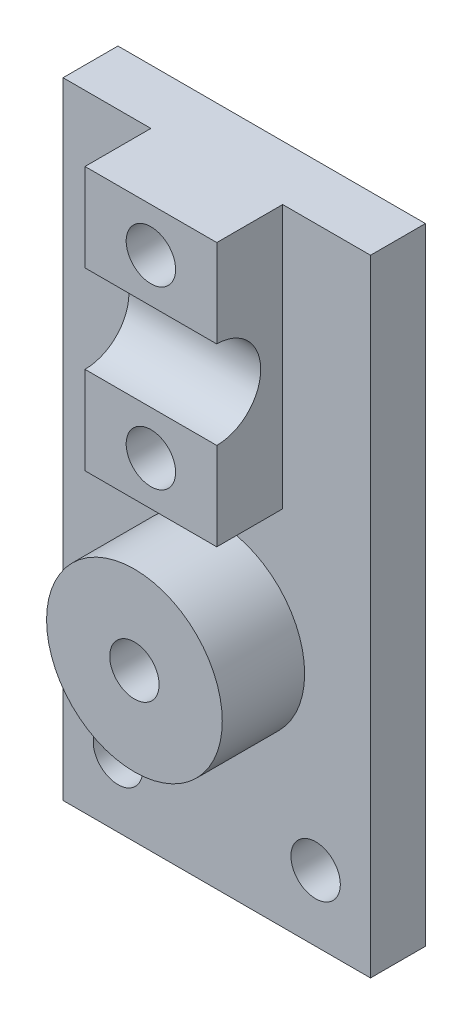
ISO-10303-21;
HEADER;
FILE_DESCRIPTION(('STEP AP214'),'2;1');
FILE_NAME('part.step','',(''),(''),'','','');
FILE_SCHEMA(('AUTOMOTIVE_DESIGN { 1 0 10303 214 1 1 1 1 }'));
ENDSEC;
DATA;
#1=APPLICATION_CONTEXT('core data for automotive mechanical design processes');
#2=APPLICATION_PROTOCOL_DEFINITION('international standard','automotive_design',2000,#1);
#3=PRODUCT_CONTEXT('',#1,'mechanical');
#4=PRODUCT('Part','Part','',(#3));
#5=PRODUCT_RELATED_PRODUCT_CATEGORY('part','',(#4));
#6=PRODUCT_DEFINITION_FORMATION('','',#4);
#7=PRODUCT_DEFINITION_CONTEXT('part definition',#1,'design');
#8=PRODUCT_DEFINITION('design','',#6,#7);
#9=PRODUCT_DEFINITION_SHAPE('','',#8);
#10=(LENGTH_UNIT() NAMED_UNIT(*) SI_UNIT(.MILLI.,.METRE.));
#11=(NAMED_UNIT(*) PLANE_ANGLE_UNIT() SI_UNIT($,.RADIAN.));
#12=(NAMED_UNIT(*) SI_UNIT($,.STERADIAN.) SOLID_ANGLE_UNIT());
#13=UNCERTAINTY_MEASURE_WITH_UNIT(LENGTH_MEASURE(1.E-05),#10,'distance_accuracy_value','');
#14=(GEOMETRIC_REPRESENTATION_CONTEXT(3) GLOBAL_UNCERTAINTY_ASSIGNED_CONTEXT((#13)) GLOBAL_UNIT_ASSIGNED_CONTEXT((#10,
#11,#12)) REPRESENTATION_CONTEXT('',''));
#15=CARTESIAN_POINT('',(0.,0.,0.));
#16=DIRECTION('',(0.,0.,1.));
#17=DIRECTION('',(1.,0.,0.));
#18=AXIS2_PLACEMENT_3D('',#15,#16,#17);
#19=CARTESIAN_POINT('',(0.,0.,5.));
#20=DIRECTION('',(0.,0.,1.));
#21=DIRECTION('',(1.,0.,0.));
#22=AXIS2_PLACEMENT_3D('',#19,#20,#21);
#23=PLANE('',#22);
#24=DIRECTION('',(0.,1.,0.));
#25=VECTOR('',#24,1.);
#26=CARTESIAN_POINT('',(6.,0.,5.));
#27=LINE('',#26,#25);
#28=CARTESIAN_POINT('',(6.,-24.,5.));
#29=VERTEX_POINT('',#28);
#30=CARTESIAN_POINT('',(6.,0.,5.));
#31=VERTEX_POINT('',#30);
#32=EDGE_CURVE('E138',#29,#31,#27,.T.);
#33=ORIENTED_EDGE('',*,*,#32,.F.);
#34=DIRECTION('',(1.,0.,0.));
#35=VECTOR('',#34,1.);
#36=CARTESIAN_POINT('',(-6.,-24.,5.));
#37=LINE('',#36,#35);
#38=CARTESIAN_POINT('',(-6.,-24.,5.));
#39=VERTEX_POINT('',#38);
#40=EDGE_CURVE('E181',#39,#29,#37,.T.);
#41=ORIENTED_EDGE('',*,*,#40,.F.);
#42=DIRECTION('',(0.,1.,0.));
#43=VECTOR('',#42,1.);
#44=CARTESIAN_POINT('',(-6.,0.,5.));
#45=LINE('',#44,#43);
#46=CARTESIAN_POINT('',(-6.,0.,5.));
#47=VERTEX_POINT('',#46);
#48=EDGE_CURVE('E129',#39,#47,#45,.T.);
#49=ORIENTED_EDGE('',*,*,#48,.T.);
#50=DIRECTION('',(-1.,0.,0.));
#51=VECTOR('',#50,1.);
#52=CARTESIAN_POINT('',(-14.,0.,5.));
#53=LINE('',#52,#51);
#54=CARTESIAN_POINT('',(-14.,0.,5.));
#55=VERTEX_POINT('',#54);
#56=EDGE_CURVE('E57',#47,#55,#53,.T.);
#57=ORIENTED_EDGE('',*,*,#56,.T.);
#58=DIRECTION('',(0.,-1.,0.));
#59=VECTOR('',#58,1.);
#60=CARTESIAN_POINT('',(-14.,0.,5.));
#61=LINE('',#60,#59);
#62=CARTESIAN_POINT('',(-14.,-57.,5.));
#63=VERTEX_POINT('',#62);
#64=EDGE_CURVE('E189',#55,#63,#61,.T.);
#65=ORIENTED_EDGE('',*,*,#64,.T.);
#66=DIRECTION('',(1.,0.,0.));
#67=VECTOR('',#66,1.);
#68=CARTESIAN_POINT('',(-14.,-57.,5.));
#69=LINE('',#68,#67);
#70=CARTESIAN_POINT('',(14.,-57.,5.));
#71=VERTEX_POINT('',#70);
#72=EDGE_CURVE('E86',#63,#71,#69,.T.);
#73=ORIENTED_EDGE('',*,*,#72,.T.);
#74=DIRECTION('',(0.,1.,0.));
#75=VECTOR('',#74,1.);
#76=CARTESIAN_POINT('',(14.,0.,5.));
#77=LINE('',#76,#75);
#78=CARTESIAN_POINT('',(14.,0.,5.));
#79=VERTEX_POINT('',#78);
#80=EDGE_CURVE('E192',#71,#79,#77,.T.);
#81=ORIENTED_EDGE('',*,*,#80,.T.);
#82=EDGE_CURVE('E199',#79,#31,#53,.T.);
#83=ORIENTED_EDGE('',*,*,#82,.T.);
#84=EDGE_LOOP('',(#33,#41,#49,#57,#65,#73,#81,#83));
#85=FACE_BOUND('',#84,.T.);
#86=CARTESIAN_POINT('',(-9.,-51.,5.));
#87=DIRECTION('',(0.,0.,1.));
#88=DIRECTION('',(1.,0.,0.));
#89=AXIS2_PLACEMENT_3D('',#86,#87,#88);
#90=CIRCLE('',#89,2.25);
#91=CARTESIAN_POINT('',(-6.75,-51.,5.));
#92=VERTEX_POINT('',#91);
#93=EDGE_CURVE('E420',#92,#92,#90,.T.);
#94=ORIENTED_EDGE('',*,*,#93,.F.);
#95=EDGE_LOOP('',(#94));
#96=FACE_BOUND('',#95,.T.);
#97=CARTESIAN_POINT('',(9.,-51.,5.));
#98=DIRECTION('',(0.,0.,1.));
#99=DIRECTION('',(1.,0.,0.));
#100=AXIS2_PLACEMENT_3D('',#97,#98,#99);
#101=CIRCLE('',#100,2.25);
#102=CARTESIAN_POINT('',(11.25,-51.,5.));
#103=VERTEX_POINT('',#102);
#104=EDGE_CURVE('E414',#103,#103,#101,.T.);
#105=ORIENTED_EDGE('',*,*,#104,.F.);
#106=EDGE_LOOP('',(#105));
#107=FACE_BOUND('',#106,.T.);
#108=CARTESIAN_POINT('',(0.,-36.,5.));
#109=DIRECTION('',(0.,0.,1.));
#110=DIRECTION('',(1.,0.,0.));
#111=AXIS2_PLACEMENT_3D('',#108,#109,#110);
#112=CIRCLE('',#111,8.);
#113=CARTESIAN_POINT('',(8.,-36.,5.));
#114=VERTEX_POINT('',#113);
#115=EDGE_CURVE('E408',#114,#114,#112,.T.);
#116=ORIENTED_EDGE('',*,*,#115,.F.);
#117=EDGE_LOOP('',(#116));
#118=FACE_BOUND('',#117,.T.);
#119=ADVANCED_FACE('F32',(#85,#96,#107,#118),#23,.T.);
#120=CARTESIAN_POINT('',(-14.,0.,5.));
#121=DIRECTION('',(1.,0.,0.));
#122=DIRECTION('',(0.,1.,0.));
#123=AXIS2_PLACEMENT_3D('',#120,#121,#122);
#124=PLANE('',#123);
#125=DIRECTION('',(0.,-1.,0.));
#126=VECTOR('',#125,1.);
#127=CARTESIAN_POINT('',(-14.,0.,0.));
#128=LINE('',#127,#126);
#129=CARTESIAN_POINT('',(-14.,0.,0.));
#130=VERTEX_POINT('',#129);
#131=CARTESIAN_POINT('',(-14.,-57.,0.));
#132=VERTEX_POINT('',#131);
#133=EDGE_CURVE('E183',#130,#132,#128,.T.);
#134=ORIENTED_EDGE('',*,*,#133,.T.);
#135=DIRECTION('',(0.,0.,-1.));
#136=VECTOR('',#135,1.);
#137=CARTESIAN_POINT('',(-14.,-57.,5.));
#138=LINE('',#137,#136);
#139=EDGE_CURVE('E11',#63,#132,#138,.T.);
#140=ORIENTED_EDGE('',*,*,#139,.F.);
#141=ORIENTED_EDGE('',*,*,#64,.F.);
#142=DIRECTION('',(0.,0.,-1.));
#143=VECTOR('',#142,1.);
#144=CARTESIAN_POINT('',(-14.,0.,5.));
#145=LINE('',#144,#143);
#146=EDGE_CURVE('E201',#55,#130,#145,.T.);
#147=ORIENTED_EDGE('',*,*,#146,.T.);
#148=EDGE_LOOP('',(#134,#140,#141,#147));
#149=FACE_BOUND('',#148,.T.);
#150=ADVANCED_FACE('F34',(#149),#124,.F.);
#151=CARTESIAN_POINT('',(-14.,-57.,5.));
#152=DIRECTION('',(0.,1.,0.));
#153=DIRECTION('',(0.,0.,1.));
#154=AXIS2_PLACEMENT_3D('',#151,#152,#153);
#155=PLANE('',#154);
#156=DIRECTION('',(1.,0.,0.));
#157=VECTOR('',#156,1.);
#158=CARTESIAN_POINT('',(-14.,-57.,0.));
#159=LINE('',#158,#157);
#160=CARTESIAN_POINT('',(14.,-57.,0.));
#161=VERTEX_POINT('',#160);
#162=EDGE_CURVE('E210',#132,#161,#159,.T.);
#163=ORIENTED_EDGE('',*,*,#162,.T.);
#164=DIRECTION('',(0.,0.,-1.));
#165=VECTOR('',#164,1.);
#166=CARTESIAN_POINT('',(14.,-57.,5.));
#167=LINE('',#166,#165);
#168=EDGE_CURVE('E41',#71,#161,#167,.T.);
#169=ORIENTED_EDGE('',*,*,#168,.F.);
#170=ORIENTED_EDGE('',*,*,#72,.F.);
#171=ORIENTED_EDGE('',*,*,#139,.T.);
#172=EDGE_LOOP('',(#163,#169,#170,#171));
#173=FACE_BOUND('',#172,.T.);
#174=ADVANCED_FACE('F219',(#173),#155,.F.);
#175=CARTESIAN_POINT('',(14.,0.,5.));
#176=DIRECTION('',(-1.,0.,0.));
#177=DIRECTION('',(0.,-1.,0.));
#178=AXIS2_PLACEMENT_3D('',#175,#176,#177);
#179=PLANE('',#178);
#180=DIRECTION('',(0.,1.,0.));
#181=VECTOR('',#180,1.);
#182=CARTESIAN_POINT('',(14.,0.,0.));
#183=LINE('',#182,#181);
#184=CARTESIAN_POINT('',(14.,0.,0.));
#185=VERTEX_POINT('',#184);
#186=EDGE_CURVE('E209',#161,#185,#183,.T.);
#187=ORIENTED_EDGE('',*,*,#186,.T.);
#188=DIRECTION('',(0.,0.,-1.));
#189=VECTOR('',#188,1.);
#190=CARTESIAN_POINT('',(14.,0.,5.));
#191=LINE('',#190,#189);
#192=EDGE_CURVE('E205',#79,#185,#191,.T.);
#193=ORIENTED_EDGE('',*,*,#192,.F.);
#194=ORIENTED_EDGE('',*,*,#80,.F.);
#195=ORIENTED_EDGE('',*,*,#168,.T.);
#196=EDGE_LOOP('',(#187,#193,#194,#195));
#197=FACE_BOUND('',#196,.T.);
#198=ADVANCED_FACE('F221',(#197),#179,.F.);
#199=CARTESIAN_POINT('',(-14.,0.,5.));
#200=DIRECTION('',(0.,-1.,0.));
#201=DIRECTION('',(0.,0.,-1.));
#202=AXIS2_PLACEMENT_3D('',#199,#200,#201);
#203=PLANE('',#202);
#204=DIRECTION('',(-1.,0.,0.));
#205=VECTOR('',#204,1.);
#206=CARTESIAN_POINT('',(-14.,0.,0.));
#207=LINE('',#206,#205);
#208=EDGE_CURVE('E79',#185,#130,#207,.T.);
#209=ORIENTED_EDGE('',*,*,#208,.T.);
#210=ORIENTED_EDGE('',*,*,#146,.F.);
#211=ORIENTED_EDGE('',*,*,#56,.F.);
#212=DIRECTION('',(0.,0.,1.));
#213=VECTOR('',#212,1.);
#214=CARTESIAN_POINT('',(-6.,0.,11.));
#215=LINE('',#214,#213);
#216=CARTESIAN_POINT('',(-6.,0.,11.));
#217=VERTEX_POINT('',#216);
#218=EDGE_CURVE('E49',#47,#217,#215,.T.);
#219=ORIENTED_EDGE('',*,*,#218,.T.);
#220=DIRECTION('',(1.,0.,0.));
#221=VECTOR('',#220,1.);
#222=CARTESIAN_POINT('',(-6.,0.,11.));
#223=LINE('',#222,#221);
#224=CARTESIAN_POINT('',(6.,0.,11.));
#225=VERTEX_POINT('',#224);
#226=EDGE_CURVE('E122',#217,#225,#223,.T.);
#227=ORIENTED_EDGE('',*,*,#226,.T.);
#228=DIRECTION('',(0.,0.,1.));
#229=VECTOR('',#228,1.);
#230=CARTESIAN_POINT('',(6.,0.,11.));
#231=LINE('',#230,#229);
#232=EDGE_CURVE('E148',#31,#225,#231,.T.);
#233=ORIENTED_EDGE('',*,*,#232,.F.);
#234=ORIENTED_EDGE('',*,*,#82,.F.);
#235=ORIENTED_EDGE('',*,*,#192,.T.);
#236=EDGE_LOOP('',(#209,#210,#211,#219,#227,#233,#234,#235));
#237=FACE_BOUND('',#236,.T.);
#238=ADVANCED_FACE('F137',(#237),#203,.F.);
#239=CARTESIAN_POINT('',(0.,0.,0.));
#240=DIRECTION('',(0.,0.,1.));
#241=DIRECTION('',(1.,0.,0.));
#242=AXIS2_PLACEMENT_3D('',#239,#240,#241);
#243=PLANE('',#242);
#244=CARTESIAN_POINT('',(0.,-36.,0.));
#245=DIRECTION('',(0.,0.,1.));
#246=DIRECTION('',(1.,0.,0.));
#247=AXIS2_PLACEMENT_3D('',#244,#245,#246);
#248=CIRCLE('',#247,2.25);
#249=CARTESIAN_POINT('',(2.25,-36.,0.));
#250=VERTEX_POINT('',#249);
#251=EDGE_CURVE('E403',#250,#250,#248,.T.);
#252=ORIENTED_EDGE('',*,*,#251,.T.);
#253=EDGE_LOOP('',(#252));
#254=FACE_BOUND('',#253,.T.);
#255=CARTESIAN_POINT('',(9.,-51.,0.));
#256=DIRECTION('',(0.,0.,1.));
#257=DIRECTION('',(1.,0.,0.));
#258=AXIS2_PLACEMENT_3D('',#255,#256,#257);
#259=CIRCLE('',#258,2.25);
#260=CARTESIAN_POINT('',(11.25,-51.,0.));
#261=VERTEX_POINT('',#260);
#262=EDGE_CURVE('E417',#261,#261,#259,.T.);
#263=ORIENTED_EDGE('',*,*,#262,.T.);
#264=EDGE_LOOP('',(#263));
#265=FACE_BOUND('',#264,.T.);
#266=CARTESIAN_POINT('',(-9.,-51.,0.));
#267=DIRECTION('',(0.,0.,1.));
#268=DIRECTION('',(1.,0.,0.));
#269=AXIS2_PLACEMENT_3D('',#266,#267,#268);
#270=CIRCLE('',#269,2.25);
#271=CARTESIAN_POINT('',(-6.75,-51.,0.));
#272=VERTEX_POINT('',#271);
#273=EDGE_CURVE('E423',#272,#272,#270,.T.);
#274=ORIENTED_EDGE('',*,*,#273,.T.);
#275=EDGE_LOOP('',(#274));
#276=FACE_BOUND('',#275,.T.);
#277=CARTESIAN_POINT('',(0.,-20.,0.));
#278=DIRECTION('',(0.,0.,1.));
#279=DIRECTION('',(1.,0.,0.));
#280=AXIS2_PLACEMENT_3D('',#277,#278,#279);
#281=CIRCLE('',#280,2.25);
#282=CARTESIAN_POINT('',(2.25,-20.,0.));
#283=VERTEX_POINT('',#282);
#284=EDGE_CURVE('E161',#283,#283,#281,.T.);
#285=ORIENTED_EDGE('',*,*,#284,.T.);
#286=EDGE_LOOP('',(#285));
#287=FACE_BOUND('',#286,.T.);
#288=CARTESIAN_POINT('',(0.,-4.,0.));
#289=DIRECTION('',(0.,0.,1.));
#290=DIRECTION('',(1.,0.,0.));
#291=AXIS2_PLACEMENT_3D('',#288,#289,#290);
#292=CIRCLE('',#291,2.25);
#293=CARTESIAN_POINT('',(2.25,-4.,0.));
#294=VERTEX_POINT('',#293);
#295=EDGE_CURVE('E150',#294,#294,#292,.T.);
#296=ORIENTED_EDGE('',*,*,#295,.T.);
#297=EDGE_LOOP('',(#296));
#298=FACE_BOUND('',#297,.T.);
#299=ORIENTED_EDGE('',*,*,#133,.F.);
#300=ORIENTED_EDGE('',*,*,#208,.F.);
#301=ORIENTED_EDGE('',*,*,#186,.F.);
#302=ORIENTED_EDGE('',*,*,#162,.F.);
#303=EDGE_LOOP('',(#299,#300,#301,#302));
#304=FACE_BOUND('',#303,.T.);
#305=ADVANCED_FACE('F217',(#254,#265,#276,#287,#298,#304),#243,.F.);
#306=CARTESIAN_POINT('',(-6.,-24.,5.));
#307=DIRECTION('',(0.,-1.,0.));
#308=DIRECTION('',(0.,0.,-1.));
#309=AXIS2_PLACEMENT_3D('',#306,#307,#308);
#310=PLANE('',#309);
#311=DIRECTION('',(0.,0.,-1.));
#312=VECTOR('',#311,1.);
#313=CARTESIAN_POINT('',(6.,-24.,5.));
#314=LINE('',#313,#312);
#315=CARTESIAN_POINT('',(6.,-24.,11.));
#316=VERTEX_POINT('',#315);
#317=EDGE_CURVE('E141',#316,#29,#314,.T.);
#318=ORIENTED_EDGE('',*,*,#317,.F.);
#319=DIRECTION('',(1.,0.,0.));
#320=VECTOR('',#319,1.);
#321=CARTESIAN_POINT('',(-6.,-24.,11.));
#322=LINE('',#321,#320);
#323=CARTESIAN_POINT('',(-6.,-24.,11.));
#324=VERTEX_POINT('',#323);
#325=EDGE_CURVE('E184',#324,#316,#322,.T.);
#326=ORIENTED_EDGE('',*,*,#325,.F.);
#327=DIRECTION('',(0.,0.,-1.));
#328=VECTOR('',#327,1.);
#329=CARTESIAN_POINT('',(-6.,-24.,5.));
#330=LINE('',#329,#328);
#331=EDGE_CURVE('E171',#324,#39,#330,.T.);
#332=ORIENTED_EDGE('',*,*,#331,.T.);
#333=ORIENTED_EDGE('',*,*,#40,.T.);
#334=EDGE_LOOP('',(#318,#326,#332,#333));
#335=FACE_BOUND('',#334,.T.);
#336=ADVANCED_FACE('F239',(#335),#310,.T.);
#337=CARTESIAN_POINT('',(-6.,-24.,11.));
#338=DIRECTION('',(0.,0.,1.));
#339=DIRECTION('',(1.,0.,0.));
#340=AXIS2_PLACEMENT_3D('',#337,#338,#339);
#341=PLANE('',#340);
#342=CARTESIAN_POINT('',(0.,-20.,11.));
#343=DIRECTION('',(0.,0.,1.));
#344=DIRECTION('',(1.,0.,0.));
#345=AXIS2_PLACEMENT_3D('',#342,#343,#344);
#346=CIRCLE('',#345,2.25);
#347=CARTESIAN_POINT('',(2.25,-20.,11.));
#348=VERTEX_POINT('',#347);
#349=EDGE_CURVE('E164',#348,#348,#346,.T.);
#350=ORIENTED_EDGE('',*,*,#349,.F.);
#351=EDGE_LOOP('',(#350));
#352=FACE_BOUND('',#351,.T.);
#353=DIRECTION('',(0.,-1.,0.));
#354=VECTOR('',#353,1.);
#355=CARTESIAN_POINT('',(6.,-24.,11.));
#356=LINE('',#355,#354);
#357=CARTESIAN_POINT('',(6.,-16.,11.));
#358=VERTEX_POINT('',#357);
#359=EDGE_CURVE('E176',#358,#316,#356,.T.);
#360=ORIENTED_EDGE('',*,*,#359,.F.);
#361=DIRECTION('',(1.,0.,0.));
#362=VECTOR('',#361,1.);
#363=CARTESIAN_POINT('',(-6.,-16.,11.));
#364=LINE('',#363,#362);
#365=CARTESIAN_POINT('',(-6.,-16.,11.));
#366=VERTEX_POINT('',#365);
#367=EDGE_CURVE('E186',#366,#358,#364,.T.);
#368=ORIENTED_EDGE('',*,*,#367,.F.);
#369=DIRECTION('',(0.,-1.,0.));
#370=VECTOR('',#369,1.);
#371=CARTESIAN_POINT('',(-6.,-24.,11.));
#372=LINE('',#371,#370);
#373=EDGE_CURVE('E168',#366,#324,#372,.T.);
#374=ORIENTED_EDGE('',*,*,#373,.T.);
#375=ORIENTED_EDGE('',*,*,#325,.T.);
#376=EDGE_LOOP('',(#360,#368,#374,#375));
#377=FACE_BOUND('',#376,.T.);
#378=ADVANCED_FACE('F258',(#352,#377),#341,.T.);
#379=CARTESIAN_POINT('',(-6.,-12.,11.));
#380=DIRECTION('',(1.,0.,0.));
#381=DIRECTION('',(0.,0.,-1.));
#382=AXIS2_PLACEMENT_3D('',#379,#380,#381);
#383=CYLINDRICAL_SURFACE('',#382,4.);
#384=CARTESIAN_POINT('',(6.,-12.,11.));
#385=DIRECTION('',(-1.,0.,0.));
#386=DIRECTION('',(0.,0.,-1.));
#387=AXIS2_PLACEMENT_3D('',#384,#385,#386);
#388=CIRCLE('',#387,4.);
#389=CARTESIAN_POINT('',(6.,-8.,11.));
#390=VERTEX_POINT('',#389);
#391=EDGE_CURVE('E153',#390,#358,#388,.T.);
#392=ORIENTED_EDGE('',*,*,#391,.F.);
#393=DIRECTION('',(1.,0.,0.));
#394=VECTOR('',#393,1.);
#395=CARTESIAN_POINT('',(-6.,-8.,11.));
#396=LINE('',#395,#394);
#397=CARTESIAN_POINT('',(-6.,-8.,11.));
#398=VERTEX_POINT('',#397);
#399=EDGE_CURVE('E128',#398,#390,#396,.T.);
#400=ORIENTED_EDGE('',*,*,#399,.F.);
#401=CARTESIAN_POINT('',(-6.,-12.,11.));
#402=DIRECTION('',(-1.,0.,0.));
#403=DIRECTION('',(0.,0.,-1.));
#404=AXIS2_PLACEMENT_3D('',#401,#402,#403);
#405=CIRCLE('',#404,4.);
#406=EDGE_CURVE('E135',#398,#366,#405,.T.);
#407=ORIENTED_EDGE('',*,*,#406,.T.);
#408=ORIENTED_EDGE('',*,*,#367,.T.);
#409=EDGE_LOOP('',(#392,#400,#407,#408));
#410=FACE_BOUND('',#409,.T.);
#411=ADVANCED_FACE('F267',(#410),#383,.F.);
#412=CARTESIAN_POINT('',(-6.,-8.,11.));
#413=DIRECTION('',(0.,0.,1.));
#414=DIRECTION('',(1.,0.,0.));
#415=AXIS2_PLACEMENT_3D('',#412,#413,#414);
#416=PLANE('',#415);
#417=CARTESIAN_POINT('',(0.,-4.,11.));
#418=DIRECTION('',(0.,0.,1.));
#419=DIRECTION('',(1.,0.,0.));
#420=AXIS2_PLACEMENT_3D('',#417,#418,#419);
#421=CIRCLE('',#420,2.25);
#422=CARTESIAN_POINT('',(2.25,-4.,11.));
#423=VERTEX_POINT('',#422);
#424=EDGE_CURVE('E156',#423,#423,#421,.T.);
#425=ORIENTED_EDGE('',*,*,#424,.F.);
#426=EDGE_LOOP('',(#425));
#427=FACE_BOUND('',#426,.T.);
#428=DIRECTION('',(0.,-1.,0.));
#429=VECTOR('',#428,1.);
#430=CARTESIAN_POINT('',(6.,-8.,11.));
#431=LINE('',#430,#429);
#432=EDGE_CURVE('E126',#225,#390,#431,.T.);
#433=ORIENTED_EDGE('',*,*,#432,.F.);
#434=ORIENTED_EDGE('',*,*,#226,.F.);
#435=DIRECTION('',(0.,-1.,0.));
#436=VECTOR('',#435,1.);
#437=CARTESIAN_POINT('',(-6.,-8.,11.));
#438=LINE('',#437,#436);
#439=EDGE_CURVE('E124',#217,#398,#438,.T.);
#440=ORIENTED_EDGE('',*,*,#439,.T.);
#441=ORIENTED_EDGE('',*,*,#399,.T.);
#442=EDGE_LOOP('',(#433,#434,#440,#441));
#443=FACE_BOUND('',#442,.T.);
#444=ADVANCED_FACE('F123',(#427,#443),#416,.T.);
#445=CARTESIAN_POINT('',(-6.,-12.,11.));
#446=DIRECTION('',(1.,0.,0.));
#447=DIRECTION('',(0.,0.,-1.));
#448=AXIS2_PLACEMENT_3D('',#445,#446,#447);
#449=PLANE('',#448);
#450=ORIENTED_EDGE('',*,*,#218,.F.);
#451=ORIENTED_EDGE('',*,*,#48,.F.);
#452=ORIENTED_EDGE('',*,*,#331,.F.);
#453=ORIENTED_EDGE('',*,*,#373,.F.);
#454=ORIENTED_EDGE('',*,*,#406,.F.);
#455=ORIENTED_EDGE('',*,*,#439,.F.);
#456=EDGE_LOOP('',(#450,#451,#452,#453,#454,#455));
#457=FACE_BOUND('',#456,.T.);
#458=ADVANCED_FACE('F132',(#457),#449,.F.);
#459=CARTESIAN_POINT('',(6.,-12.,11.));
#460=DIRECTION('',(1.,0.,0.));
#461=DIRECTION('',(0.,0.,-1.));
#462=AXIS2_PLACEMENT_3D('',#459,#460,#461);
#463=PLANE('',#462);
#464=ORIENTED_EDGE('',*,*,#232,.T.);
#465=ORIENTED_EDGE('',*,*,#432,.T.);
#466=ORIENTED_EDGE('',*,*,#391,.T.);
#467=ORIENTED_EDGE('',*,*,#359,.T.);
#468=ORIENTED_EDGE('',*,*,#317,.T.);
#469=ORIENTED_EDGE('',*,*,#32,.T.);
#470=EDGE_LOOP('',(#464,#465,#466,#467,#468,#469));
#471=FACE_BOUND('',#470,.T.);
#472=ADVANCED_FACE('F288',(#471),#463,.T.);
#473=CARTESIAN_POINT('',(0.,-4.,0.));
#474=DIRECTION('',(0.,0.,1.));
#475=DIRECTION('',(1.,0.,0.));
#476=AXIS2_PLACEMENT_3D('',#473,#474,#475);
#477=CYLINDRICAL_SURFACE('',#476,2.25);
#478=ORIENTED_EDGE('',*,*,#295,.F.);
#479=EDGE_LOOP('',(#478));
#480=FACE_BOUND('',#479,.T.);
#481=ORIENTED_EDGE('',*,*,#424,.T.);
#482=EDGE_LOOP('',(#481));
#483=FACE_BOUND('',#482,.T.);
#484=ADVANCED_FACE('F294',(#480,#483),#477,.F.);
#485=CARTESIAN_POINT('',(0.,-20.,0.));
#486=DIRECTION('',(0.,0.,1.));
#487=DIRECTION('',(1.,0.,0.));
#488=AXIS2_PLACEMENT_3D('',#485,#486,#487);
#489=CYLINDRICAL_SURFACE('',#488,2.25);
#490=ORIENTED_EDGE('',*,*,#284,.F.);
#491=EDGE_LOOP('',(#490));
#492=FACE_BOUND('',#491,.T.);
#493=ORIENTED_EDGE('',*,*,#349,.T.);
#494=EDGE_LOOP('',(#493));
#495=FACE_BOUND('',#494,.T.);
#496=ADVANCED_FACE('F300',(#492,#495),#489,.F.);
#497=CARTESIAN_POINT('',(-9.,-51.,0.));
#498=DIRECTION('',(0.,0.,1.));
#499=DIRECTION('',(1.,0.,0.));
#500=AXIS2_PLACEMENT_3D('',#497,#498,#499);
#501=CYLINDRICAL_SURFACE('',#500,2.25);
#502=ORIENTED_EDGE('',*,*,#273,.F.);
#503=EDGE_LOOP('',(#502));
#504=FACE_BOUND('',#503,.T.);
#505=ORIENTED_EDGE('',*,*,#93,.T.);
#506=EDGE_LOOP('',(#505));
#507=FACE_BOUND('',#506,.T.);
#508=ADVANCED_FACE('F308',(#504,#507),#501,.F.);
#509=CARTESIAN_POINT('',(9.,-51.,0.));
#510=DIRECTION('',(0.,0.,1.));
#511=DIRECTION('',(1.,0.,0.));
#512=AXIS2_PLACEMENT_3D('',#509,#510,#511);
#513=CYLINDRICAL_SURFACE('',#512,2.25);
#514=ORIENTED_EDGE('',*,*,#262,.F.);
#515=EDGE_LOOP('',(#514));
#516=FACE_BOUND('',#515,.T.);
#517=ORIENTED_EDGE('',*,*,#104,.T.);
#518=EDGE_LOOP('',(#517));
#519=FACE_BOUND('',#518,.T.);
#520=ADVANCED_FACE('F316',(#516,#519),#513,.F.);
#521=CARTESIAN_POINT('',(0.,-36.,12.5));
#522=DIRECTION('',(0.,0.,-1.));
#523=DIRECTION('',(-1.,0.,0.));
#524=AXIS2_PLACEMENT_3D('',#521,#522,#523);
#525=CYLINDRICAL_SURFACE('',#524,8.);
#526=CARTESIAN_POINT('',(0.,-36.,12.5));
#527=DIRECTION('',(0.,0.,1.));
#528=DIRECTION('',(1.,0.,0.));
#529=AXIS2_PLACEMENT_3D('',#526,#527,#528);
#530=CIRCLE('',#529,8.);
#531=CARTESIAN_POINT('',(8.,-36.,12.5));
#532=VERTEX_POINT('',#531);
#533=EDGE_CURVE('E411',#532,#532,#530,.T.);
#534=ORIENTED_EDGE('',*,*,#533,.F.);
#535=EDGE_LOOP('',(#534));
#536=FACE_BOUND('',#535,.T.);
#537=ORIENTED_EDGE('',*,*,#115,.T.);
#538=EDGE_LOOP('',(#537));
#539=FACE_BOUND('',#538,.T.);
#540=ADVANCED_FACE('F324',(#536,#539),#525,.T.);
#541=CARTESIAN_POINT('',(0.,-36.,12.5));
#542=DIRECTION('',(0.,0.,1.));
#543=DIRECTION('',(1.,0.,0.));
#544=AXIS2_PLACEMENT_3D('',#541,#542,#543);
#545=PLANE('',#544);
#546=CARTESIAN_POINT('',(0.,-36.,12.5));
#547=DIRECTION('',(0.,0.,1.));
#548=DIRECTION('',(1.,0.,0.));
#549=AXIS2_PLACEMENT_3D('',#546,#547,#548);
#550=CIRCLE('',#549,2.25);
#551=CARTESIAN_POINT('',(2.25,-36.,12.5));
#552=VERTEX_POINT('',#551);
#553=EDGE_CURVE('E406',#552,#552,#550,.T.);
#554=ORIENTED_EDGE('',*,*,#553,.F.);
#555=EDGE_LOOP('',(#554));
#556=FACE_BOUND('',#555,.T.);
#557=ORIENTED_EDGE('',*,*,#533,.T.);
#558=EDGE_LOOP('',(#557));
#559=FACE_BOUND('',#558,.T.);
#560=ADVANCED_FACE('F331',(#556,#559),#545,.T.);
#561=CARTESIAN_POINT('',(0.,-36.,0.));
#562=DIRECTION('',(0.,0.,1.));
#563=DIRECTION('',(1.,0.,0.));
#564=AXIS2_PLACEMENT_3D('',#561,#562,#563);
#565=CYLINDRICAL_SURFACE('',#564,2.25);
#566=ORIENTED_EDGE('',*,*,#251,.F.);
#567=EDGE_LOOP('',(#566));
#568=FACE_BOUND('',#567,.T.);
#569=ORIENTED_EDGE('',*,*,#553,.T.);
#570=EDGE_LOOP('',(#569));
#571=FACE_BOUND('',#570,.T.);
#572=ADVANCED_FACE('F338',(#568,#571),#565,.F.);
#573=CLOSED_SHELL('',(#119,#150,#174,#198,#238,#305,#336,#378,#411,#444,#458,#472,#484,#496,
#508,#520,#540,#560,#572));
#574=MANIFOLD_SOLID_BREP('B2',#573);
#575=ADVANCED_BREP_SHAPE_REPRESENTATION('',(#18,#574),#14);
#576=SHAPE_DEFINITION_REPRESENTATION(#9,#575);
ENDSEC;
END-ISO-10303-21;
